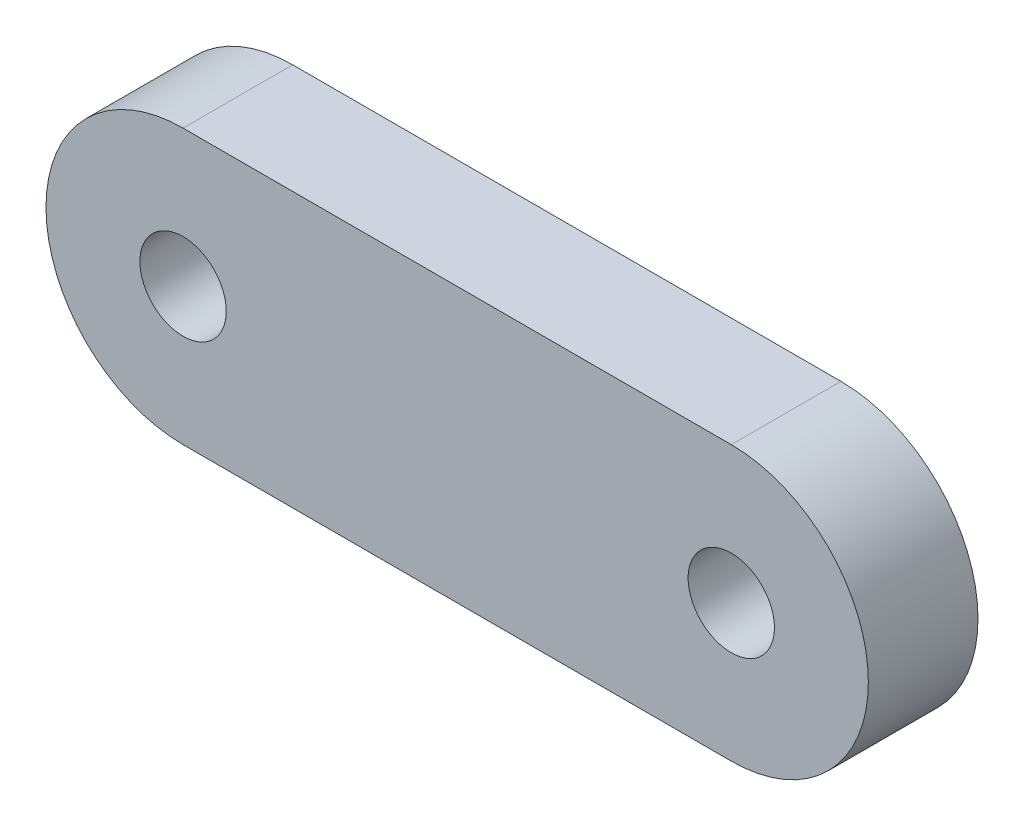
ISO-10303-21;
HEADER;
FILE_DESCRIPTION(('STEP AP214'),'2;1');
FILE_NAME('part.step','',(''),(''),'','','');
FILE_SCHEMA(('AUTOMOTIVE_DESIGN { 1 0 10303 214 1 1 1 1 }'));
ENDSEC;
DATA;
#1=APPLICATION_CONTEXT('core data for automotive mechanical design processes');
#2=APPLICATION_PROTOCOL_DEFINITION('international standard','automotive_design',2000,#1);
#3=PRODUCT_CONTEXT('',#1,'mechanical');
#4=PRODUCT('Part','Part','',(#3));
#5=PRODUCT_RELATED_PRODUCT_CATEGORY('part','',(#4));
#6=PRODUCT_DEFINITION_FORMATION('','',#4);
#7=PRODUCT_DEFINITION_CONTEXT('part definition',#1,'design');
#8=PRODUCT_DEFINITION('design','',#6,#7);
#9=PRODUCT_DEFINITION_SHAPE('','',#8);
#10=(LENGTH_UNIT() NAMED_UNIT(*) SI_UNIT(.MILLI.,.METRE.));
#11=(NAMED_UNIT(*) PLANE_ANGLE_UNIT() SI_UNIT($,.RADIAN.));
#12=(NAMED_UNIT(*) SI_UNIT($,.STERADIAN.) SOLID_ANGLE_UNIT());
#13=UNCERTAINTY_MEASURE_WITH_UNIT(LENGTH_MEASURE(1.E-05),#10,'distance_accuracy_value','');
#14=(GEOMETRIC_REPRESENTATION_CONTEXT(3) GLOBAL_UNCERTAINTY_ASSIGNED_CONTEXT((#13)) GLOBAL_UNIT_ASSIGNED_CONTEXT((#10,
#11,#12)) REPRESENTATION_CONTEXT('',''));
#15=CARTESIAN_POINT('',(0.,0.,0.));
#16=DIRECTION('',(0.,0.,1.));
#17=DIRECTION('',(1.,0.,0.));
#18=AXIS2_PLACEMENT_3D('',#15,#16,#17);
#19=CARTESIAN_POINT('',(0.,0.,5.08));
#20=DIRECTION('',(0.,0.,1.));
#21=DIRECTION('',(1.,0.,0.));
#22=AXIS2_PLACEMENT_3D('',#19,#20,#21);
#23=PLANE('',#22);
#24=CARTESIAN_POINT('',(0.,0.,5.08));
#25=DIRECTION('',(0.,0.,1.));
#26=DIRECTION('',(1.,0.,0.));
#27=AXIS2_PLACEMENT_3D('',#24,#25,#26);
#28=CIRCLE('',#27,2.);
#29=CARTESIAN_POINT('',(2.,0.,5.08));
#30=VERTEX_POINT('',#29);
#31=EDGE_CURVE('E100',#30,#30,#28,.T.);
#32=ORIENTED_EDGE('',*,*,#31,.F.);
#33=EDGE_LOOP('',(#32));
#34=FACE_BOUND('',#33,.T.);
#35=CARTESIAN_POINT('',(0.,0.,5.08));
#36=DIRECTION('',(0.,0.,1.));
#37=DIRECTION('',(1.,0.,0.));
#38=AXIS2_PLACEMENT_3D('',#35,#36,#37);
#39=CIRCLE('',#38,6.35);
#40=CARTESIAN_POINT('',(0.,6.35,5.08));
#41=VERTEX_POINT('',#40);
#42=CARTESIAN_POINT('',(0.,-6.35,5.08));
#43=VERTEX_POINT('',#42);
#44=EDGE_CURVE('E85',#41,#43,#39,.T.);
#45=ORIENTED_EDGE('',*,*,#44,.T.);
#46=DIRECTION('',(1.,0.,0.));
#47=VECTOR('',#46,1.);
#48=CARTESIAN_POINT('',(0.,-6.35,5.08));
#49=LINE('',#48,#47);
#50=CARTESIAN_POINT('',(25.4,-6.35,5.08));
#51=VERTEX_POINT('',#50);
#52=EDGE_CURVE('E80',#43,#51,#49,.T.);
#53=ORIENTED_EDGE('',*,*,#52,.T.);
#54=CARTESIAN_POINT('',(25.4,0.,5.08));
#55=DIRECTION('',(0.,0.,1.));
#56=DIRECTION('',(1.,0.,0.));
#57=AXIS2_PLACEMENT_3D('',#54,#55,#56);
#58=CIRCLE('',#57,6.35);
#59=CARTESIAN_POINT('',(25.4,6.35,5.08));
#60=VERTEX_POINT('',#59);
#61=EDGE_CURVE('E83',#51,#60,#58,.T.);
#62=ORIENTED_EDGE('',*,*,#61,.T.);
#63=DIRECTION('',(-1.,0.,0.));
#64=VECTOR('',#63,1.);
#65=CARTESIAN_POINT('',(0.,6.35,5.08));
#66=LINE('',#65,#64);
#67=EDGE_CURVE('E50',#60,#41,#66,.T.);
#68=ORIENTED_EDGE('',*,*,#67,.T.);
#69=EDGE_LOOP('',(#45,#53,#62,#68));
#70=FACE_BOUND('',#69,.T.);
#71=CARTESIAN_POINT('',(25.4,0.,5.08));
#72=DIRECTION('',(0.,0.,1.));
#73=DIRECTION('',(1.,0.,0.));
#74=AXIS2_PLACEMENT_3D('',#71,#72,#73);
#75=CIRCLE('',#74,2.);
#76=CARTESIAN_POINT('',(27.4,0.,5.08));
#77=VERTEX_POINT('',#76);
#78=EDGE_CURVE('E115',#77,#77,#75,.T.);
#79=ORIENTED_EDGE('',*,*,#78,.F.);
#80=EDGE_LOOP('',(#79));
#81=FACE_BOUND('',#80,.T.);
#82=ADVANCED_FACE('F33',(#34,#70,#81),#23,.T.);
#83=CARTESIAN_POINT('',(0.,0.,0.));
#84=DIRECTION('',(0.,0.,1.));
#85=DIRECTION('',(1.,0.,0.));
#86=AXIS2_PLACEMENT_3D('',#83,#84,#85);
#87=PLANE('',#86);
#88=CARTESIAN_POINT('',(0.,0.,0.));
#89=DIRECTION('',(0.,0.,1.));
#90=DIRECTION('',(1.,0.,0.));
#91=AXIS2_PLACEMENT_3D('',#88,#89,#90);
#92=CIRCLE('',#91,2.);
#93=CARTESIAN_POINT('',(2.,0.,0.));
#94=VERTEX_POINT('',#93);
#95=EDGE_CURVE('E112',#94,#94,#92,.T.);
#96=ORIENTED_EDGE('',*,*,#95,.T.);
#97=EDGE_LOOP('',(#96));
#98=FACE_BOUND('',#97,.T.);
#99=CARTESIAN_POINT('',(0.,0.,0.));
#100=DIRECTION('',(0.,0.,1.));
#101=DIRECTION('',(1.,0.,0.));
#102=AXIS2_PLACEMENT_3D('',#99,#100,#101);
#103=CIRCLE('',#102,6.35);
#104=CARTESIAN_POINT('',(0.,6.35,0.));
#105=VERTEX_POINT('',#104);
#106=CARTESIAN_POINT('',(0.,-6.35,0.));
#107=VERTEX_POINT('',#106);
#108=EDGE_CURVE('E97',#105,#107,#103,.T.);
#109=ORIENTED_EDGE('',*,*,#108,.F.);
#110=DIRECTION('',(-1.,0.,0.));
#111=VECTOR('',#110,1.);
#112=CARTESIAN_POINT('',(0.,6.35,0.));
#113=LINE('',#112,#111);
#114=CARTESIAN_POINT('',(25.4,6.35,0.));
#115=VERTEX_POINT('',#114);
#116=EDGE_CURVE('E73',#115,#105,#113,.T.);
#117=ORIENTED_EDGE('',*,*,#116,.F.);
#118=CARTESIAN_POINT('',(25.4,0.,0.));
#119=DIRECTION('',(0.,0.,1.));
#120=DIRECTION('',(1.,0.,0.));
#121=AXIS2_PLACEMENT_3D('',#118,#119,#120);
#122=CIRCLE('',#121,6.35);
#123=CARTESIAN_POINT('',(25.4,-6.35,0.));
#124=VERTEX_POINT('',#123);
#125=EDGE_CURVE('E67',#124,#115,#122,.T.);
#126=ORIENTED_EDGE('',*,*,#125,.F.);
#127=DIRECTION('',(1.,0.,0.));
#128=VECTOR('',#127,1.);
#129=CARTESIAN_POINT('',(0.,-6.35,0.));
#130=LINE('',#129,#128);
#131=EDGE_CURVE('E89',#107,#124,#130,.T.);
#132=ORIENTED_EDGE('',*,*,#131,.F.);
#133=EDGE_LOOP('',(#109,#117,#126,#132));
#134=FACE_BOUND('',#133,.T.);
#135=CARTESIAN_POINT('',(25.4,0.,0.));
#136=DIRECTION('',(0.,0.,1.));
#137=DIRECTION('',(1.,0.,0.));
#138=AXIS2_PLACEMENT_3D('',#135,#136,#137);
#139=CIRCLE('',#138,2.);
#140=CARTESIAN_POINT('',(27.4,0.,0.));
#141=VERTEX_POINT('',#140);
#142=EDGE_CURVE('E118',#141,#141,#139,.T.);
#143=ORIENTED_EDGE('',*,*,#142,.T.);
#144=EDGE_LOOP('',(#143));
#145=FACE_BOUND('',#144,.T.);
#146=ADVANCED_FACE('F108',(#98,#134,#145),#87,.F.);
#147=CARTESIAN_POINT('',(0.,0.,5.08));
#148=DIRECTION('',(0.,0.,-1.));
#149=DIRECTION('',(-1.,0.,0.));
#150=AXIS2_PLACEMENT_3D('',#147,#148,#149);
#151=CYLINDRICAL_SURFACE('',#150,6.35);
#152=ORIENTED_EDGE('',*,*,#108,.T.);
#153=DIRECTION('',(0.,0.,-1.));
#154=VECTOR('',#153,1.);
#155=CARTESIAN_POINT('',(0.,-6.35,5.08));
#156=LINE('',#155,#154);
#157=EDGE_CURVE('E11',#43,#107,#156,.T.);
#158=ORIENTED_EDGE('',*,*,#157,.F.);
#159=ORIENTED_EDGE('',*,*,#44,.F.);
#160=DIRECTION('',(0.,0.,-1.));
#161=VECTOR('',#160,1.);
#162=CARTESIAN_POINT('',(0.,6.35,5.08));
#163=LINE('',#162,#161);
#164=EDGE_CURVE('E93',#41,#105,#163,.T.);
#165=ORIENTED_EDGE('',*,*,#164,.T.);
#166=EDGE_LOOP('',(#152,#158,#159,#165));
#167=FACE_BOUND('',#166,.T.);
#168=ADVANCED_FACE('F35',(#167),#151,.T.);
#169=CARTESIAN_POINT('',(0.,-6.35,5.08));
#170=DIRECTION('',(0.,1.,0.));
#171=DIRECTION('',(0.,0.,1.));
#172=AXIS2_PLACEMENT_3D('',#169,#170,#171);
#173=PLANE('',#172);
#174=ORIENTED_EDGE('',*,*,#131,.T.);
#175=DIRECTION('',(0.,0.,-1.));
#176=VECTOR('',#175,1.);
#177=CARTESIAN_POINT('',(25.4,-6.35,5.08));
#178=LINE('',#177,#176);
#179=EDGE_CURVE('E42',#51,#124,#178,.T.);
#180=ORIENTED_EDGE('',*,*,#179,.F.);
#181=ORIENTED_EDGE('',*,*,#52,.F.);
#182=ORIENTED_EDGE('',*,*,#157,.T.);
#183=EDGE_LOOP('',(#174,#180,#181,#182));
#184=FACE_BOUND('',#183,.T.);
#185=ADVANCED_FACE('F88',(#184),#173,.F.);
#186=CARTESIAN_POINT('',(25.4,0.,5.08));
#187=DIRECTION('',(0.,0.,-1.));
#188=DIRECTION('',(-1.,0.,0.));
#189=AXIS2_PLACEMENT_3D('',#186,#187,#188);
#190=CYLINDRICAL_SURFACE('',#189,6.35);
#191=ORIENTED_EDGE('',*,*,#125,.T.);
#192=DIRECTION('',(0.,0.,-1.));
#193=VECTOR('',#192,1.);
#194=CARTESIAN_POINT('',(25.4,6.35,5.08));
#195=LINE('',#194,#193);
#196=EDGE_CURVE('E90',#60,#115,#195,.T.);
#197=ORIENTED_EDGE('',*,*,#196,.F.);
#198=ORIENTED_EDGE('',*,*,#61,.F.);
#199=ORIENTED_EDGE('',*,*,#179,.T.);
#200=EDGE_LOOP('',(#191,#197,#198,#199));
#201=FACE_BOUND('',#200,.T.);
#202=ADVANCED_FACE('F91',(#201),#190,.T.);
#203=CARTESIAN_POINT('',(0.,6.35,5.08));
#204=DIRECTION('',(0.,-1.,0.));
#205=DIRECTION('',(0.,0.,-1.));
#206=AXIS2_PLACEMENT_3D('',#203,#204,#205);
#207=PLANE('',#206);
#208=ORIENTED_EDGE('',*,*,#116,.T.);
#209=ORIENTED_EDGE('',*,*,#164,.F.);
#210=ORIENTED_EDGE('',*,*,#67,.F.);
#211=ORIENTED_EDGE('',*,*,#196,.T.);
#212=EDGE_LOOP('',(#208,#209,#210,#211));
#213=FACE_BOUND('',#212,.T.);
#214=ADVANCED_FACE('F105',(#213),#207,.F.);
#215=CARTESIAN_POINT('',(0.,0.,5.08));
#216=DIRECTION('',(0.,0.,-1.));
#217=DIRECTION('',(-1.,0.,0.));
#218=AXIS2_PLACEMENT_3D('',#215,#216,#217);
#219=CYLINDRICAL_SURFACE('',#218,2.);
#220=ORIENTED_EDGE('',*,*,#31,.T.);
#221=EDGE_LOOP('',(#220));
#222=FACE_BOUND('',#221,.T.);
#223=ORIENTED_EDGE('',*,*,#95,.F.);
#224=EDGE_LOOP('',(#223));
#225=FACE_BOUND('',#224,.T.);
#226=ADVANCED_FACE('F136',(#222,#225),#219,.F.);
#227=CARTESIAN_POINT('',(25.4,0.,5.08));
#228=DIRECTION('',(0.,0.,-1.));
#229=DIRECTION('',(-1.,0.,0.));
#230=AXIS2_PLACEMENT_3D('',#227,#228,#229);
#231=CYLINDRICAL_SURFACE('',#230,2.);
#232=ORIENTED_EDGE('',*,*,#78,.T.);
#233=EDGE_LOOP('',(#232));
#234=FACE_BOUND('',#233,.T.);
#235=ORIENTED_EDGE('',*,*,#142,.F.);
#236=EDGE_LOOP('',(#235));
#237=FACE_BOUND('',#236,.T.);
#238=ADVANCED_FACE('F124',(#234,#237),#231,.F.);
#239=CLOSED_SHELL('',(#82,#146,#168,#185,#202,#214,#226,#238));
#240=MANIFOLD_SOLID_BREP('B2',#239);
#241=ADVANCED_BREP_SHAPE_REPRESENTATION('',(#18,#240),#14);
#242=SHAPE_DEFINITION_REPRESENTATION(#9,#241);
ENDSEC;
END-ISO-10303-21;
